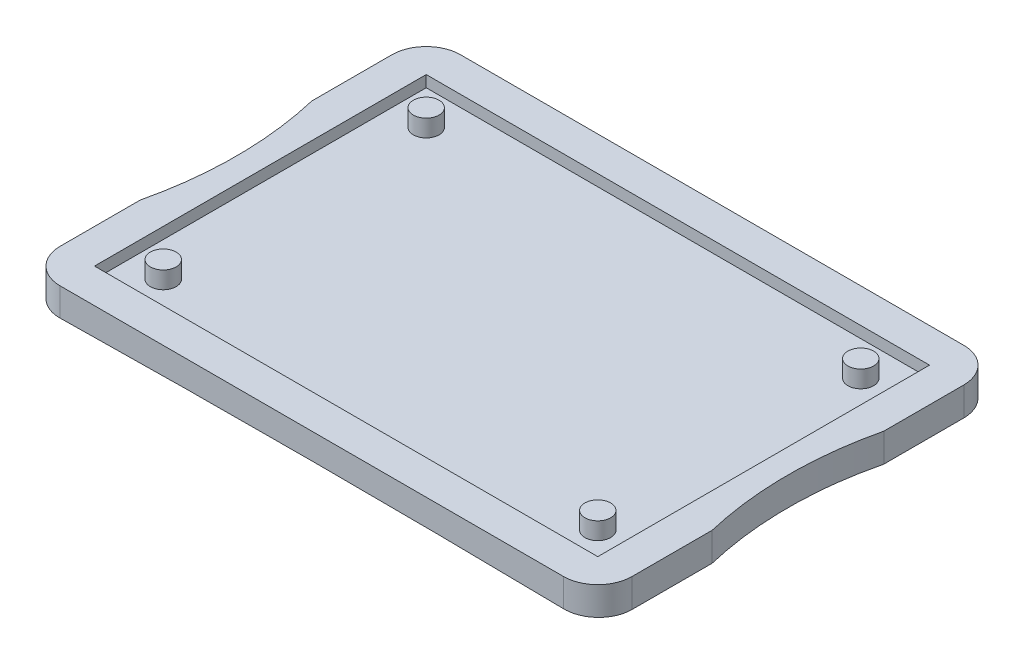
ISO-10303-21;
HEADER;
FILE_DESCRIPTION(('STEP AP214'),'2;1');
FILE_NAME('part.step','',(''),(''),'','','');
FILE_SCHEMA(('AUTOMOTIVE_DESIGN { 1 0 10303 214 1 1 1 1 }'));
ENDSEC;
DATA;
#1=APPLICATION_CONTEXT('core data for automotive mechanical design processes');
#2=APPLICATION_PROTOCOL_DEFINITION('international standard','automotive_design',2000,#1);
#3=PRODUCT_CONTEXT('',#1,'mechanical');
#4=PRODUCT('Part','Part','',(#3));
#5=PRODUCT_RELATED_PRODUCT_CATEGORY('part','',(#4));
#6=PRODUCT_DEFINITION_FORMATION('','',#4);
#7=PRODUCT_DEFINITION_CONTEXT('part definition',#1,'design');
#8=PRODUCT_DEFINITION('design','',#6,#7);
#9=PRODUCT_DEFINITION_SHAPE('','',#8);
#10=(LENGTH_UNIT() NAMED_UNIT(*) SI_UNIT(.MILLI.,.METRE.));
#11=(NAMED_UNIT(*) PLANE_ANGLE_UNIT() SI_UNIT($,.RADIAN.));
#12=(NAMED_UNIT(*) SI_UNIT($,.STERADIAN.) SOLID_ANGLE_UNIT());
#13=UNCERTAINTY_MEASURE_WITH_UNIT(LENGTH_MEASURE(1.E-05),#10,'distance_accuracy_value','');
#14=(GEOMETRIC_REPRESENTATION_CONTEXT(3) GLOBAL_UNCERTAINTY_ASSIGNED_CONTEXT((#13)) GLOBAL_UNIT_ASSIGNED_CONTEXT((#10,
#11,#12)) REPRESENTATION_CONTEXT('',''));
#15=CARTESIAN_POINT('',(0.,0.,0.));
#16=DIRECTION('',(0.,0.,1.));
#17=DIRECTION('',(1.,0.,0.));
#18=AXIS2_PLACEMENT_3D('',#15,#16,#17);
#19=CARTESIAN_POINT('',(0.,0.,0.));
#20=DIRECTION('',(0.,1.,0.));
#21=DIRECTION('',(0.,0.,1.));
#22=AXIS2_PLACEMENT_3D('',#19,#20,#21);
#23=PLANE('',#22);
#24=DIRECTION('',(0.,0.,1.));
#25=VECTOR('',#24,1.);
#26=CARTESIAN_POINT('',(-22.0000000000004,0.,0.));
#27=LINE('',#26,#25);
#28=CARTESIAN_POINT('',(-22.0000000000004,0.,-14.5000000000004));
#29=VERTEX_POINT('',#28);
#30=CARTESIAN_POINT('',(-22.0000000000004,0.,14.5000000000003));
#31=VERTEX_POINT('',#30);
#32=EDGE_CURVE('E268',#29,#31,#27,.T.);
#33=ORIENTED_EDGE('',*,*,#32,.F.);
#34=DIRECTION('',(1.,0.,0.));
#35=VECTOR('',#34,1.);
#36=CARTESIAN_POINT('',(0.,0.,-14.5000000000004));
#37=LINE('',#36,#35);
#38=CARTESIAN_POINT('',(22.0000000000004,0.,-14.5000000000004));
#39=VERTEX_POINT('',#38);
#40=EDGE_CURVE('E56',#29,#39,#37,.T.);
#41=ORIENTED_EDGE('',*,*,#40,.T.);
#42=DIRECTION('',(0.,0.,1.));
#43=VECTOR('',#42,1.);
#44=CARTESIAN_POINT('',(22.0000000000004,0.,0.));
#45=LINE('',#44,#43);
#46=CARTESIAN_POINT('',(22.0000000000004,0.,14.5000000000003));
#47=VERTEX_POINT('',#46);
#48=EDGE_CURVE('E277',#39,#47,#45,.T.);
#49=ORIENTED_EDGE('',*,*,#48,.T.);
#50=DIRECTION('',(1.,0.,0.));
#51=VECTOR('',#50,1.);
#52=CARTESIAN_POINT('',(0.,0.,14.5000000000003));
#53=LINE('',#52,#51);
#54=EDGE_CURVE('E273',#31,#47,#53,.T.);
#55=ORIENTED_EDGE('',*,*,#54,.F.);
#56=EDGE_LOOP('',(#33,#41,#49,#55));
#57=FACE_BOUND('',#56,.T.);
#58=DIRECTION('',(1.,0.,0.));
#59=VECTOR('',#58,1.);
#60=CARTESIAN_POINT('',(0.,0.,17.5));
#61=LINE('',#60,#59);
#62=CARTESIAN_POINT('',(-22.0000000000004,0.,17.5));
#63=VERTEX_POINT('',#62);
#64=CARTESIAN_POINT('',(22.0000000000004,0.,17.5));
#65=VERTEX_POINT('',#64);
#66=EDGE_CURVE('E162',#63,#65,#61,.T.);
#67=ORIENTED_EDGE('',*,*,#66,.T.);
#68=CARTESIAN_POINT('',(22.0000000000004,0.,14.5000000000004));
#69=DIRECTION('',(0.,1.,0.));
#70=DIRECTION('',(0.,0.,1.));
#71=AXIS2_PLACEMENT_3D('',#68,#69,#70);
#72=CIRCLE('',#71,2.99999999999957);
#73=CARTESIAN_POINT('',(25.,0.,14.5000000000004));
#74=VERTEX_POINT('',#73);
#75=EDGE_CURVE('E159',#65,#74,#72,.T.);
#76=ORIENTED_EDGE('',*,*,#75,.T.);
#77=DIRECTION('',(0.,0.,-1.));
#78=VECTOR('',#77,1.);
#79=CARTESIAN_POINT('',(25.,0.,0.));
#80=LINE('',#79,#78);
#81=CARTESIAN_POINT('',(25.,0.,7.49999999999998));
#82=VERTEX_POINT('',#81);
#83=EDGE_CURVE('E156',#74,#82,#80,.T.);
#84=ORIENTED_EDGE('',*,*,#83,.T.);
#85=CARTESIAN_POINT('',(56.7301610379397,0.,0.));
#86=DIRECTION('',(0.,1.,0.));
#87=DIRECTION('',(0.,0.,1.));
#88=AXIS2_PLACEMENT_3D('',#85,#86,#87);
#89=CIRCLE('',#88,32.6044953878079);
#90=CARTESIAN_POINT('',(25.,0.,-7.49999999999997));
#91=VERTEX_POINT('',#90);
#92=EDGE_CURVE('E153',#82,#91,#89,.F.);
#93=ORIENTED_EDGE('',*,*,#92,.T.);
#94=CARTESIAN_POINT('',(25.,0.,-14.5000000000004));
#95=VERTEX_POINT('',#94);
#96=EDGE_CURVE('E152',#91,#95,#80,.T.);
#97=ORIENTED_EDGE('',*,*,#96,.T.);
#98=CARTESIAN_POINT('',(22.0000000000004,0.,-14.5000000000004));
#99=DIRECTION('',(0.,1.,0.));
#100=DIRECTION('',(0.,0.,1.));
#101=AXIS2_PLACEMENT_3D('',#98,#99,#100);
#102=CIRCLE('',#101,2.99999999999957);
#103=CARTESIAN_POINT('',(22.0000000000004,0.,-17.5));
#104=VERTEX_POINT('',#103);
#105=EDGE_CURVE('E147',#95,#104,#102,.T.);
#106=ORIENTED_EDGE('',*,*,#105,.T.);
#107=DIRECTION('',(1.,0.,0.));
#108=VECTOR('',#107,1.);
#109=CARTESIAN_POINT('',(0.,0.,-17.5));
#110=LINE('',#109,#108);
#111=CARTESIAN_POINT('',(-22.0000000000004,0.,-17.5));
#112=VERTEX_POINT('',#111);
#113=EDGE_CURVE('E141',#112,#104,#110,.T.);
#114=ORIENTED_EDGE('',*,*,#113,.F.);
#115=CARTESIAN_POINT('',(-22.0000000000004,0.,-14.5000000000004));
#116=DIRECTION('',(0.,1.,0.));
#117=DIRECTION('',(0.,0.,1.));
#118=AXIS2_PLACEMENT_3D('',#115,#116,#117);
#119=CIRCLE('',#118,2.99999999999957);
#120=CARTESIAN_POINT('',(-25.,0.,-14.5000000000004));
#121=VERTEX_POINT('',#120);
#122=EDGE_CURVE('E135',#121,#112,#119,.F.);
#123=ORIENTED_EDGE('',*,*,#122,.F.);
#124=DIRECTION('',(0.,0.,-1.));
#125=VECTOR('',#124,1.);
#126=CARTESIAN_POINT('',(-25.,0.,0.));
#127=LINE('',#126,#125);
#128=CARTESIAN_POINT('',(-25.,0.,-7.50000000000004));
#129=VERTEX_POINT('',#128);
#130=EDGE_CURVE('E132',#129,#121,#127,.T.);
#131=ORIENTED_EDGE('',*,*,#130,.F.);
#132=CARTESIAN_POINT('',(-56.7301610379397,0.,0.));
#133=DIRECTION('',(0.,1.,0.));
#134=DIRECTION('',(0.,0.,1.));
#135=AXIS2_PLACEMENT_3D('',#132,#133,#134);
#136=CIRCLE('',#135,32.6044953878079);
#137=CARTESIAN_POINT('',(-25.,0.,7.50000000000003));
#138=VERTEX_POINT('',#137);
#139=EDGE_CURVE('E130',#138,#129,#136,.T.);
#140=ORIENTED_EDGE('',*,*,#139,.F.);
#141=CARTESIAN_POINT('',(-25.,0.,14.5000000000003));
#142=VERTEX_POINT('',#141);
#143=EDGE_CURVE('E118',#142,#138,#127,.T.);
#144=ORIENTED_EDGE('',*,*,#143,.F.);
#145=CARTESIAN_POINT('',(-22.0000000000004,0.,14.5000000000003));
#146=DIRECTION('',(0.,1.,0.));
#147=DIRECTION('',(0.,0.,1.));
#148=AXIS2_PLACEMENT_3D('',#145,#146,#147);
#149=CIRCLE('',#148,2.99999999999971);
#150=EDGE_CURVE('E106',#63,#142,#149,.F.);
#151=ORIENTED_EDGE('',*,*,#150,.F.);
#152=EDGE_LOOP('',(#67,#76,#84,#93,#97,#106,#114,#123,#131,#140,#144,#151));
#153=FACE_BOUND('',#152,.T.);
#154=ADVANCED_FACE('F39',(#57,#153),#23,.T.);
#155=CARTESIAN_POINT('',(0.,-2.5,17.5));
#156=DIRECTION('',(0.,0.,1.));
#157=DIRECTION('',(1.,0.,0.));
#158=AXIS2_PLACEMENT_3D('',#155,#156,#157);
#159=PLANE('',#158);
#160=CARTESIAN_POINT('',(0.,-1252.375,17.5));
#161=DIRECTION('',(0.,0.,1.));
#162=DIRECTION('',(-1.,0.,0.));
#163=AXIS2_PLACEMENT_3D('',#160,#161,#162);
#164=CIRCLE('',#163,1250.125);
#165=CARTESIAN_POINT('',(22.0000000000004,-2.44359563214402,17.5));
#166=VERTEX_POINT('',#165);
#167=CARTESIAN_POINT('',(-22.0000000000004,-2.44359563214402,17.5));
#168=VERTEX_POINT('',#167);
#169=EDGE_CURVE('E287',#166,#168,#164,.T.);
#170=ORIENTED_EDGE('',*,*,#169,.F.);
#171=DIRECTION('',(0.,1.,0.));
#172=VECTOR('',#171,1.);
#173=CARTESIAN_POINT('',(22.0000000000004,-2.5,17.5));
#174=LINE('',#173,#172);
#175=EDGE_CURVE('E43',#166,#65,#174,.T.);
#176=ORIENTED_EDGE('',*,*,#175,.T.);
#177=ORIENTED_EDGE('',*,*,#66,.F.);
#178=DIRECTION('',(0.,1.,0.));
#179=VECTOR('',#178,1.);
#180=CARTESIAN_POINT('',(-22.0000000000004,-2.5,17.5));
#181=LINE('',#180,#179);
#182=EDGE_CURVE('E11',#168,#63,#181,.T.);
#183=ORIENTED_EDGE('',*,*,#182,.F.);
#184=EDGE_LOOP('',(#170,#176,#177,#183));
#185=FACE_BOUND('',#184,.T.);
#186=ADVANCED_FACE('F41',(#185),#159,.T.);
#187=CARTESIAN_POINT('',(-22.0000000000004,-2.5,14.5000000000003));
#188=DIRECTION('',(0.,1.,0.));
#189=DIRECTION('',(0.,0.,1.));
#190=AXIS2_PLACEMENT_3D('',#187,#188,#189);
#191=CYLINDRICAL_SURFACE('',#190,2.99999999999971);
#192=DIRECTION('',(0.,1.,0.));
#193=VECTOR('',#192,1.);
#194=CARTESIAN_POINT('',(-25.,-2.5,14.5000000000003));
#195=LINE('',#194,#193);
#196=CARTESIAN_POINT('',(-25.,-2.5,14.5000000000003));
#197=VERTEX_POINT('',#196);
#198=EDGE_CURVE('E48',#197,#142,#195,.T.);
#199=ORIENTED_EDGE('',*,*,#198,.F.);
#200=CARTESIAN_POINT('',(-25.0000000000001,-2.49999999999995,14.5000000000003));
#201=CARTESIAN_POINT('',(-25.0000080943151,-2.5000002258265,14.5843680196033));
#202=CARTESIAN_POINT('',(-24.9964410482757,-2.4999288156822,14.6687322009698));
#203=CARTESIAN_POINT('',(-24.9822193128772,-2.49964443997647,14.836856848726));
#204=CARTESIAN_POINT('',(-24.9715649666263,-2.49943148126765,14.9206173441429));
#205=CARTESIAN_POINT('',(-24.9432420435681,-2.49886594003202,15.0868835425197));
#206=CARTESIAN_POINT('',(-24.9255788135852,-2.4985134639385,15.1693901523223));
#207=CARTESIAN_POINT('',(-24.8833815474104,-2.49767266403158,15.3326016998995));
#208=CARTESIAN_POINT('',(-24.8588475945012,-2.49718434186483,15.4133066594999));
#209=CARTESIAN_POINT('',(-24.7751382560609,-2.49552128352641,15.6519400461725));
#210=CARTESIAN_POINT('',(-24.7058437355695,-2.49414822103403,15.8064550368164));
#211=CARTESIAN_POINT('',(-24.5423503202833,-2.49092725450145,16.1015441272843));
#212=CARTESIAN_POINT('',(-24.4481557689012,-2.48907943327691,16.2421206525759));
#213=CARTESIAN_POINT('',(-24.2374958347857,-2.48497664136367,16.505501132801));
#214=CARTESIAN_POINT('',(-24.1210285601652,-2.4827216360889,16.6283035764127));
#215=CARTESIAN_POINT('',(-23.8691119515847,-2.47788545224965,16.8526314486162));
#216=CARTESIAN_POINT('',(-23.733658899384,-2.4753042098035,16.9541526996828));
#217=CARTESIAN_POINT('',(-23.4475967358469,-2.46990508819591,17.1330481607604));
#218=CARTESIAN_POINT('',(-23.2969818964498,-2.46708711966737,17.2104131990356));
#219=CARTESIAN_POINT('',(-22.984933599399,-2.46130988579311,17.3387184186104));
#220=CARTESIAN_POINT('',(-22.8235065189199,-2.45835070402751,17.3896740241638));
#221=CARTESIAN_POINT('',(-22.5509120279788,-2.45340897219411,17.4510690511583));
#222=CARTESIAN_POINT('',(-22.4414580678721,-2.45143889924269,17.4694070141888));
#223=CARTESIAN_POINT('',(-22.2213514407036,-2.44750634839786,17.4938709045381));
#224=CARTESIAN_POINT('',(-22.1107006960843,-2.44554386369247,17.5000141325517));
#225=CARTESIAN_POINT('',(-22.0000000000004,-2.44359563214423,17.5));
#226=B_SPLINE_CURVE_WITH_KNOTS('',3,(#200,#201,#202,#203,#204,#205,#206,#207,#208,#209,#210,
#211,#212,#213,#214,#215,#216,#217,#218,#219,#220,#221,#222,#223,#224,#225),.UNSPECIFIED.,.F.,
.F.,(4,2,2,2,2,2,2,2,2,2,2,2,4),(0.,0.253021727857576,0.506031207397822,0.758848045065451,
1.01166181837214,1.51708483358746,2.02241974393697,2.52779759746472,3.03327456460016,
3.5389432206995,4.04431621062554,4.37667454005049,4.70856101410207),.UNSPECIFIED.);
#227=EDGE_CURVE('E164',#197,#168,#226,.T.);
#228=ORIENTED_EDGE('',*,*,#227,.T.);
#229=ORIENTED_EDGE('',*,*,#182,.T.);
#230=ORIENTED_EDGE('',*,*,#150,.T.);
#231=EDGE_LOOP('',(#199,#228,#229,#230));
#232=FACE_BOUND('',#231,.T.);
#233=ADVANCED_FACE('F108',(#232),#191,.T.);
#234=CARTESIAN_POINT('',(-25.,-2.5,0.));
#235=DIRECTION('',(1.,0.,0.));
#236=DIRECTION('',(0.,0.,-1.));
#237=AXIS2_PLACEMENT_3D('',#234,#235,#236);
#238=PLANE('',#237);
#239=ORIENTED_EDGE('',*,*,#143,.T.);
#240=DIRECTION('',(0.,1.,0.));
#241=VECTOR('',#240,1.);
#242=CARTESIAN_POINT('',(-25.,-2.5,7.50000000000003));
#243=LINE('',#242,#241);
#244=CARTESIAN_POINT('',(-25.,-2.5,7.50000000000003));
#245=VERTEX_POINT('',#244);
#246=EDGE_CURVE('E126',#245,#138,#243,.T.);
#247=ORIENTED_EDGE('',*,*,#246,.F.);
#248=DIRECTION('',(0.,0.,-1.));
#249=VECTOR('',#248,1.);
#250=CARTESIAN_POINT('',(-25.,-2.5,0.));
#251=LINE('',#250,#249);
#252=EDGE_CURVE('E125',#197,#245,#251,.T.);
#253=ORIENTED_EDGE('',*,*,#252,.F.);
#254=ORIENTED_EDGE('',*,*,#198,.T.);
#255=EDGE_LOOP('',(#239,#247,#253,#254));
#256=FACE_BOUND('',#255,.T.);
#257=ADVANCED_FACE('F121',(#256),#238,.F.);
#258=CARTESIAN_POINT('',(-56.7301610379397,-2.5,0.));
#259=DIRECTION('',(0.,1.,0.));
#260=DIRECTION('',(0.,0.,1.));
#261=AXIS2_PLACEMENT_3D('',#258,#259,#260);
#262=CYLINDRICAL_SURFACE('',#261,32.6044953878079);
#263=DIRECTION('',(0.,1.,0.));
#264=VECTOR('',#263,1.);
#265=CARTESIAN_POINT('',(-25.,-2.5,-7.50000000000004));
#266=LINE('',#265,#264);
#267=CARTESIAN_POINT('',(-25.,-2.5,-7.50000000002705));
#268=VERTEX_POINT('',#267);
#269=EDGE_CURVE('E331',#268,#129,#266,.T.);
#270=ORIENTED_EDGE('',*,*,#269,.F.);
#271=CARTESIAN_POINT('',(-25.,-2.49999999999995,-7.50000000000004));
#272=CARTESIAN_POINT('',(-24.8935874789443,-2.4978718645789,-7.04979737294275));
#273=CARTESIAN_POINT('',(-24.7967697792002,-2.49594853593022,-6.5973873203352));
#274=CARTESIAN_POINT('',(-24.6224653902994,-2.49250249679365,-5.68885156003972));
#275=CARTESIAN_POINT('',(-24.5449789265648,-2.49097979097742,-5.23272580908693));
#276=CARTESIAN_POINT('',(-24.3417041288131,-2.48699863887152,-3.85965251272831));
#277=CARTESIAN_POINT('',(-24.245144025662,-2.48512802095555,-2.93819361789949));
#278=CARTESIAN_POINT('',(-24.1318543359527,-2.48293578183063,-1.10825505410329));
#279=CARTESIAN_POINT('',(-24.1136331293482,-2.48258521677869,-0.199864248013373));
#280=CARTESIAN_POINT('',(-24.1530543074769,-2.48334623166317,1.61495481412062));
#281=CARTESIAN_POINT('',(-24.2106547074646,-2.48445700241304,2.52138387813735));
#282=CARTESIAN_POINT('',(-24.3419818271918,-2.48701116663494,3.76526191430653));
#283=CARTESIAN_POINT('',(-24.383461432071,-2.48781925995652,4.10636683304635));
#284=CARTESIAN_POINT('',(-24.4771732589934,-2.48965091306505,4.78705027085108));
#285=CARTESIAN_POINT('',(-24.5294033796691,-2.49067443074459,5.12662907498545));
#286=CARTESIAN_POINT('',(-24.6449943520294,-2.49294826342736,5.80645904156246));
#287=CARTESIAN_POINT('',(-24.7084344819484,-2.4942001960025,6.14669668021696));
#288=CARTESIAN_POINT('',(-24.8461258250531,-2.49692982218441,6.82504532798825));
#289=CARTESIAN_POINT('',(-24.9203791397939,-2.49840755967939,7.16315591035312));
#290=CARTESIAN_POINT('',(-25.,-2.49999999999996,7.50000000000003));
#291=B_SPLINE_CURVE_WITH_KNOTS('',3,(#271,#272,#273,#274,#275,#276,#277,#278,#279,#280,#281,
#282,#283,#284,#285,#286,#287,#288,#289,#290),.UNSPECIFIED.,.F.,.F.,(4,2,2,2,2,2,2,2,2,4),(0.,
1.38761401794717,2.77524421615729,5.55107210119524,8.27380572333535,10.9950323185259,
12.0257690594783,13.0563045167438,14.0944431493892,15.1327838154346),.UNSPECIFIED.);
#292=EDGE_CURVE('E178',#268,#245,#291,.T.);
#293=ORIENTED_EDGE('',*,*,#292,.T.);
#294=ORIENTED_EDGE('',*,*,#246,.T.);
#295=ORIENTED_EDGE('',*,*,#139,.T.);
#296=EDGE_LOOP('',(#270,#293,#294,#295));
#297=FACE_BOUND('',#296,.T.);
#298=ADVANCED_FACE('F234',(#297),#262,.F.);
#299=ORIENTED_EDGE('',*,*,#130,.T.);
#300=DIRECTION('',(0.,1.,0.));
#301=VECTOR('',#300,1.);
#302=CARTESIAN_POINT('',(-25.,-2.5,-14.5000000000004));
#303=LINE('',#302,#301);
#304=CARTESIAN_POINT('',(-25.,-2.5,-14.5000000000004));
#305=VERTEX_POINT('',#304);
#306=EDGE_CURVE('E329',#305,#121,#303,.T.);
#307=ORIENTED_EDGE('',*,*,#306,.F.);
#308=EDGE_CURVE('E165',#268,#305,#251,.T.);
#309=ORIENTED_EDGE('',*,*,#308,.F.);
#310=ORIENTED_EDGE('',*,*,#269,.T.);
#311=EDGE_LOOP('',(#299,#307,#309,#310));
#312=FACE_BOUND('',#311,.T.);
#313=ADVANCED_FACE('F233',(#312),#238,.F.);
#314=CARTESIAN_POINT('',(-22.0000000000004,-2.5,-14.5000000000004));
#315=DIRECTION('',(0.,1.,0.));
#316=DIRECTION('',(0.,0.,1.));
#317=AXIS2_PLACEMENT_3D('',#314,#315,#316);
#318=CYLINDRICAL_SURFACE('',#317,2.99999999999957);
#319=DIRECTION('',(0.,1.,0.));
#320=VECTOR('',#319,1.);
#321=CARTESIAN_POINT('',(-22.0000000000004,-2.5,-17.5));
#322=LINE('',#321,#320);
#323=CARTESIAN_POINT('',(-22.0000000000004,-2.44359563214402,-17.5));
#324=VERTEX_POINT('',#323);
#325=EDGE_CURVE('E327',#324,#112,#322,.T.);
#326=ORIENTED_EDGE('',*,*,#325,.F.);
#327=CARTESIAN_POINT('',(-22.0000000000004,-2.44359563214402,-17.5));
#328=CARTESIAN_POINT('',(-22.0843915307538,-2.4450809215032,-17.5000080778842));
#329=CARTESIAN_POINT('',(-22.1687790729649,-2.44657485455215,-17.4964390635945));
#330=CARTESIAN_POINT('',(-22.3369501155067,-2.44956890316565,-17.4822094449819));
#331=CARTESIAN_POINT('',(-22.4207336445433,-2.45106901843098,-17.4715491799486));
#332=CARTESIAN_POINT('',(-22.5870462545633,-2.45406334504735,-17.4432102977759));
#333=CARTESIAN_POINT('',(-22.6695762311411,-2.45555755998861,-17.4255369621547));
#334=CARTESIAN_POINT('',(-22.8328338693148,-2.45852918989367,-17.3833152385647));
#335=CARTESIAN_POINT('',(-22.9135615529062,-2.4600066050624,-17.3587669345484));
#336=CARTESIAN_POINT('',(-23.1522623502335,-2.46439776144914,-17.2750077044542));
#337=CARTESIAN_POINT('',(-23.3068208012794,-2.46727163235487,-17.2056708818632));
#338=CARTESIAN_POINT('',(-23.6019898514725,-2.47281039722407,-17.0420734499964));
#339=CARTESIAN_POINT('',(-23.7426029135432,-2.4754753280714,-16.9478172525997));
#340=CARTESIAN_POINT('',(-24.00602524638,-2.48050695589955,-16.7370292679186));
#341=CARTESIAN_POINT('',(-24.1288356164471,-2.48287367129373,-16.6204988570789));
#342=CARTESIAN_POINT('',(-24.3531672094673,-2.48722443693995,-16.3684421891725));
#343=CARTESIAN_POINT('',(-24.4546842722032,-2.48920841240743,-16.2329122286488));
#344=CARTESIAN_POINT('',(-24.6335220993257,-2.49272024672698,-15.9467349092314));
#345=CARTESIAN_POINT('',(-24.7108420198175,-2.49424808967097,-15.7960870233298));
#346=CARTESIAN_POINT('',(-24.8390517055855,-2.49678942369588,-15.4839743086418));
#347=CARTESIAN_POINT('',(-24.8899570250151,-2.49780321746498,-15.3225159089812));
#348=CARTESIAN_POINT('',(-24.951222307938,-2.4990250659577,-15.0500553325425));
#349=CARTESIAN_POINT('',(-24.9695028854316,-2.49939026669562,-14.9407692191108));
#350=CARTESIAN_POINT('',(-24.9938901206846,-2.49987778816292,-14.7210040318401));
#351=CARTESIAN_POINT('',(-25.0000140328711,-2.50000045313174,-14.6105268729054));
#352=CARTESIAN_POINT('',(-25.,-2.49999999999996,-14.5000000000004));
#353=B_SPLINE_CURVE_WITH_KNOTS('',3,(#327,#328,#329,#330,#331,#332,#333,#334,#335,#336,#337,
#338,#339,#340,#341,#342,#343,#344,#345,#346,#347,#348,#349,#350,#351,#352),.UNSPECIFIED.,.F.,
.F.,(4,2,2,2,2,2,2,2,2,2,2,2,4),(0.,0.253131453157025,0.506250795799775,0.759179875853131,
1.01210586743938,1.51775468416597,2.02331403760123,2.52884215987031,3.03446895877152,
3.54011338985082,4.04545973497031,4.37724522119267,4.70855945372909),.UNSPECIFIED.);
#354=EDGE_CURVE('E221',#324,#305,#353,.T.);
#355=ORIENTED_EDGE('',*,*,#354,.T.);
#356=ORIENTED_EDGE('',*,*,#306,.T.);
#357=ORIENTED_EDGE('',*,*,#122,.T.);
#358=EDGE_LOOP('',(#326,#355,#356,#357));
#359=FACE_BOUND('',#358,.T.);
#360=ADVANCED_FACE('F228',(#359),#318,.T.);
#361=CARTESIAN_POINT('',(0.,-2.5,-17.5));
#362=DIRECTION('',(0.,0.,1.));
#363=DIRECTION('',(1.,0.,0.));
#364=AXIS2_PLACEMENT_3D('',#361,#362,#363);
#365=PLANE('',#364);
#366=DIRECTION('',(0.,1.,0.));
#367=VECTOR('',#366,1.);
#368=CARTESIAN_POINT('',(22.0000000000004,-2.5,-17.5));
#369=LINE('',#368,#367);
#370=CARTESIAN_POINT('',(22.0000000000004,-2.44359563214402,-17.5));
#371=VERTEX_POINT('',#370);
#372=EDGE_CURVE('E325',#371,#104,#369,.T.);
#373=ORIENTED_EDGE('',*,*,#372,.F.);
#374=CARTESIAN_POINT('',(0.,-1252.375,-17.5));
#375=DIRECTION('',(0.,0.,1.));
#376=DIRECTION('',(-1.,0.,0.));
#377=AXIS2_PLACEMENT_3D('',#374,#375,#376);
#378=CIRCLE('',#377,1250.125);
#379=EDGE_CURVE('E298',#371,#324,#378,.T.);
#380=ORIENTED_EDGE('',*,*,#379,.T.);
#381=ORIENTED_EDGE('',*,*,#325,.T.);
#382=ORIENTED_EDGE('',*,*,#113,.T.);
#383=EDGE_LOOP('',(#373,#380,#381,#382));
#384=FACE_BOUND('',#383,.T.);
#385=ADVANCED_FACE('F232',(#384),#365,.F.);
#386=CARTESIAN_POINT('',(22.0000000000004,-2.5,-14.5000000000004));
#387=DIRECTION('',(0.,1.,0.));
#388=DIRECTION('',(0.,0.,1.));
#389=AXIS2_PLACEMENT_3D('',#386,#387,#388);
#390=CYLINDRICAL_SURFACE('',#389,2.99999999999957);
#391=CARTESIAN_POINT('',(22.0000000000004,-2.44359563214402,-17.5));
#392=CARTESIAN_POINT('',(22.0843915307538,-2.4450809215032,-17.5000080778842));
#393=CARTESIAN_POINT('',(22.1687790729649,-2.44657485455215,-17.4964390635945));
#394=CARTESIAN_POINT('',(22.3369501155067,-2.44956890316565,-17.4822094449819));
#395=CARTESIAN_POINT('',(22.4207336445433,-2.45106901843098,-17.4715491799486));
#396=CARTESIAN_POINT('',(22.5870462545633,-2.45406334504735,-17.4432102977759));
#397=CARTESIAN_POINT('',(22.6695762311411,-2.45555755998861,-17.4255369621547));
#398=CARTESIAN_POINT('',(22.8328338693148,-2.45852918989367,-17.3833152385647));
#399=CARTESIAN_POINT('',(22.9135615529062,-2.4600066050624,-17.3587669345484));
#400=CARTESIAN_POINT('',(23.1522623502335,-2.46439776144915,-17.2750077044542));
#401=CARTESIAN_POINT('',(23.3068208012794,-2.46727163235487,-17.2056708818632));
#402=CARTESIAN_POINT('',(23.6019898514725,-2.47281039722407,-17.0420734499964));
#403=CARTESIAN_POINT('',(23.7426029135432,-2.4754753280714,-16.9478172525997));
#404=CARTESIAN_POINT('',(24.0060252463799,-2.48050695589955,-16.7370292679186));
#405=CARTESIAN_POINT('',(24.1288356164471,-2.48287367129373,-16.6204988570789));
#406=CARTESIAN_POINT('',(24.3531672094673,-2.48722443693995,-16.3684421891725));
#407=CARTESIAN_POINT('',(24.4546842722032,-2.48920841240743,-16.2329122286488));
#408=CARTESIAN_POINT('',(24.6335220993257,-2.49272024672698,-15.9467349092314));
#409=CARTESIAN_POINT('',(24.7108420198175,-2.49424808967097,-15.7960870233298));
#410=CARTESIAN_POINT('',(24.8390517055855,-2.49678942369588,-15.4839743086418));
#411=CARTESIAN_POINT('',(24.8899570250151,-2.49780321746498,-15.3225159089812));
#412=CARTESIAN_POINT('',(24.951222307938,-2.4990250659577,-15.0500553325425));
#413=CARTESIAN_POINT('',(24.9695028854316,-2.49939026669562,-14.9407692191108));
#414=CARTESIAN_POINT('',(24.9938901206846,-2.49987778816292,-14.7210040318401));
#415=CARTESIAN_POINT('',(25.0000140328711,-2.50000045313174,-14.6105268729054));
#416=CARTESIAN_POINT('',(25.,-2.49999999999996,-14.5000000000004));
#417=B_SPLINE_CURVE_WITH_KNOTS('',3,(#391,#392,#393,#394,#395,#396,#397,#398,#399,#400,#401,
#402,#403,#404,#405,#406,#407,#408,#409,#410,#411,#412,#413,#414,#415,#416),.UNSPECIFIED.,.F.,
.F.,(4,2,2,2,2,2,2,2,2,2,2,2,4),(0.,0.253131453157025,0.506250795799775,0.759179875853131,
1.01210586743938,1.51775468416597,2.02331403760123,2.52884215987031,3.03446895877152,
3.54011338985082,4.04545973497031,4.37724522119267,4.70855945372909),.UNSPECIFIED.);
#418=CARTESIAN_POINT('',(25.,-2.5,-14.5000000000004));
#419=VERTEX_POINT('',#418);
#420=EDGE_CURVE('E65',#371,#419,#417,.T.);
#421=ORIENTED_EDGE('',*,*,#420,.F.);
#422=ORIENTED_EDGE('',*,*,#372,.T.);
#423=ORIENTED_EDGE('',*,*,#105,.F.);
#424=DIRECTION('',(0.,1.,0.));
#425=VECTOR('',#424,1.);
#426=CARTESIAN_POINT('',(25.,-2.5,-14.5000000000004));
#427=LINE('',#426,#425);
#428=EDGE_CURVE('E323',#419,#95,#427,.T.);
#429=ORIENTED_EDGE('',*,*,#428,.F.);
#430=EDGE_LOOP('',(#421,#422,#423,#429));
#431=FACE_BOUND('',#430,.T.);
#432=ADVANCED_FACE('F237',(#431),#390,.T.);
#433=CARTESIAN_POINT('',(25.,-2.5,0.));
#434=DIRECTION('',(1.,0.,0.));
#435=DIRECTION('',(0.,0.,-1.));
#436=AXIS2_PLACEMENT_3D('',#433,#434,#435);
#437=PLANE('',#436);
#438=ORIENTED_EDGE('',*,*,#96,.F.);
#439=DIRECTION('',(0.,1.,0.));
#440=VECTOR('',#439,1.);
#441=CARTESIAN_POINT('',(25.,-2.5,-7.49999999999997));
#442=LINE('',#441,#440);
#443=CARTESIAN_POINT('',(25.,-2.5,-7.49999999999997));
#444=VERTEX_POINT('',#443);
#445=EDGE_CURVE('E316',#444,#91,#442,.T.);
#446=ORIENTED_EDGE('',*,*,#445,.F.);
#447=DIRECTION('',(0.,0.,-1.));
#448=VECTOR('',#447,1.);
#449=CARTESIAN_POINT('',(25.,-2.5,0.));
#450=LINE('',#449,#448);
#451=EDGE_CURVE('E168',#444,#419,#450,.T.);
#452=ORIENTED_EDGE('',*,*,#451,.T.);
#453=ORIENTED_EDGE('',*,*,#428,.T.);
#454=EDGE_LOOP('',(#438,#446,#452,#453));
#455=FACE_BOUND('',#454,.T.);
#456=ADVANCED_FACE('F242',(#455),#437,.T.);
#457=CARTESIAN_POINT('',(56.7301610379397,-2.5,0.));
#458=DIRECTION('',(0.,1.,0.));
#459=DIRECTION('',(0.,0.,1.));
#460=AXIS2_PLACEMENT_3D('',#457,#458,#459);
#461=CYLINDRICAL_SURFACE('',#460,32.6044953878079);
#462=CARTESIAN_POINT('',(25.,-2.49999999999995,-7.49999999999998));
#463=CARTESIAN_POINT('',(24.8935874789443,-2.4978718645789,-7.04979737294269));
#464=CARTESIAN_POINT('',(24.7967697792002,-2.49594853593022,-6.59738732033514));
#465=CARTESIAN_POINT('',(24.6224653902994,-2.49250249679365,-5.68885156003966));
#466=CARTESIAN_POINT('',(24.5449789265648,-2.49097979097742,-5.23272580908687));
#467=CARTESIAN_POINT('',(24.3417041288131,-2.48699863887152,-3.85965251272824));
#468=CARTESIAN_POINT('',(24.245144025662,-2.48512802095555,-2.93819361789942));
#469=CARTESIAN_POINT('',(24.1318543359527,-2.48293578183063,-1.10825505410323));
#470=CARTESIAN_POINT('',(24.1136331293482,-2.48258521677869,-0.199864248013308));
#471=CARTESIAN_POINT('',(24.1530543074769,-2.48334623166317,1.61495481412069));
#472=CARTESIAN_POINT('',(24.2106547074646,-2.48445700241304,2.52138387813741));
#473=CARTESIAN_POINT('',(24.3419818271918,-2.48701116663494,3.76526191430656));
#474=CARTESIAN_POINT('',(24.383461432071,-2.48781925995652,4.10636683304635));
#475=CARTESIAN_POINT('',(24.4771732589934,-2.48965091306505,4.78705027085102));
#476=CARTESIAN_POINT('',(24.5294033796691,-2.49067443074459,5.12662907498536));
#477=CARTESIAN_POINT('',(24.6449943520293,-2.49294826342736,5.8064590415623));
#478=CARTESIAN_POINT('',(24.7084344819484,-2.4942001960025,6.14669668021677));
#479=CARTESIAN_POINT('',(24.8461258250531,-2.49692982218441,6.825045327988));
#480=CARTESIAN_POINT('',(24.9203791397939,-2.49840755967939,7.16315591035284));
#481=CARTESIAN_POINT('',(24.9999999999999,-2.49999999999996,7.49999999999972));
#482=B_SPLINE_CURVE_WITH_KNOTS('',3,(#462,#463,#464,#465,#466,#467,#468,#469,#470,#471,#472,
#473,#474,#475,#476,#477,#478,#479,#480,#481),.UNSPECIFIED.,.F.,.F.,(4,2,2,2,2,2,2,2,2,4),(0.,
1.38761401794717,2.77524421615729,5.55107210119524,8.27380572333535,10.9950323185259,
12.0257690594783,13.0563045167436,14.0944431493889,15.1327838154342),.UNSPECIFIED.);
#483=CARTESIAN_POINT('',(25.,-2.5,7.50000000002705));
#484=VERTEX_POINT('',#483);
#485=EDGE_CURVE('E208',#444,#484,#482,.T.);
#486=ORIENTED_EDGE('',*,*,#485,.F.);
#487=ORIENTED_EDGE('',*,*,#445,.T.);
#488=ORIENTED_EDGE('',*,*,#92,.F.);
#489=DIRECTION('',(0.,1.,0.));
#490=VECTOR('',#489,1.);
#491=CARTESIAN_POINT('',(25.,-2.5,7.49999999999998));
#492=LINE('',#491,#490);
#493=EDGE_CURVE('E314',#484,#82,#492,.T.);
#494=ORIENTED_EDGE('',*,*,#493,.F.);
#495=EDGE_LOOP('',(#486,#487,#488,#494));
#496=FACE_BOUND('',#495,.T.);
#497=ADVANCED_FACE('F245',(#496),#461,.F.);
#498=ORIENTED_EDGE('',*,*,#83,.F.);
#499=DIRECTION('',(0.,1.,0.));
#500=VECTOR('',#499,1.);
#501=CARTESIAN_POINT('',(25.,-2.5,14.5000000000004));
#502=LINE('',#501,#500);
#503=CARTESIAN_POINT('',(25.,-2.5,14.5000000000004));
#504=VERTEX_POINT('',#503);
#505=EDGE_CURVE('E317',#504,#74,#502,.T.);
#506=ORIENTED_EDGE('',*,*,#505,.F.);
#507=EDGE_CURVE('E117',#504,#484,#450,.T.);
#508=ORIENTED_EDGE('',*,*,#507,.T.);
#509=ORIENTED_EDGE('',*,*,#493,.T.);
#510=EDGE_LOOP('',(#498,#506,#508,#509));
#511=FACE_BOUND('',#510,.T.);
#512=ADVANCED_FACE('F247',(#511),#437,.T.);
#513=CARTESIAN_POINT('',(22.0000000000004,-2.5,14.5000000000004));
#514=DIRECTION('',(0.,1.,0.));
#515=DIRECTION('',(0.,0.,1.));
#516=AXIS2_PLACEMENT_3D('',#513,#514,#515);
#517=CYLINDRICAL_SURFACE('',#516,2.99999999999957);
#518=CARTESIAN_POINT('',(25.,-2.49999999999995,14.5000000000004));
#519=CARTESIAN_POINT('',(25.000008094315,-2.5000002258265,14.5843680196035));
#520=CARTESIAN_POINT('',(24.9964410482756,-2.4999288156822,14.6687322009699));
#521=CARTESIAN_POINT('',(24.9822193128771,-2.49964443997647,14.8368568487261));
#522=CARTESIAN_POINT('',(24.9715649666262,-2.49943148126765,14.920617344143));
#523=CARTESIAN_POINT('',(24.943242043568,-2.49886594003202,15.0868835425199));
#524=CARTESIAN_POINT('',(24.9255788135851,-2.4985134639385,15.1693901523224));
#525=CARTESIAN_POINT('',(24.8833815474103,-2.49767266403158,15.3326016998996));
#526=CARTESIAN_POINT('',(24.8588475945011,-2.49718434186483,15.4133066595));
#527=CARTESIAN_POINT('',(24.7751382560608,-2.49552128352641,15.6519400461726));
#528=CARTESIAN_POINT('',(24.7058437355694,-2.49414822103403,15.8064550368165));
#529=CARTESIAN_POINT('',(24.5423503202832,-2.49092725450145,16.1015441272843));
#530=CARTESIAN_POINT('',(24.4481557689012,-2.48907943327691,16.242120652576));
#531=CARTESIAN_POINT('',(24.2374958347857,-2.48497664136367,16.5055011328011));
#532=CARTESIAN_POINT('',(24.1210285601652,-2.4827216360889,16.6283035764127));
#533=CARTESIAN_POINT('',(23.8691119515847,-2.47788545224965,16.8526314486162));
#534=CARTESIAN_POINT('',(23.733658899384,-2.4753042098035,16.9541526996828));
#535=CARTESIAN_POINT('',(23.4475967358469,-2.46990508819591,17.1330481607604));
#536=CARTESIAN_POINT('',(23.2969818964498,-2.46708711966738,17.2104131990356));
#537=CARTESIAN_POINT('',(22.984933599399,-2.46130988579311,17.3387184186104));
#538=CARTESIAN_POINT('',(22.82350651892,-2.45835070402751,17.3896740241638));
#539=CARTESIAN_POINT('',(22.5509120279789,-2.45340897219411,17.4510690511583));
#540=CARTESIAN_POINT('',(22.4414580678721,-2.45143889924269,17.4694070141888));
#541=CARTESIAN_POINT('',(22.2213514407037,-2.44750634839786,17.4938709045381));
#542=CARTESIAN_POINT('',(22.1107006960844,-2.44554386369248,17.5000141325517));
#543=CARTESIAN_POINT('',(22.0000000000004,-2.44359563214423,17.5));
#544=B_SPLINE_CURVE_WITH_KNOTS('',3,(#518,#519,#520,#521,#522,#523,#524,#525,#526,#527,#528,
#529,#530,#531,#532,#533,#534,#535,#536,#537,#538,#539,#540,#541,#542,#543),.UNSPECIFIED.,.F.,
.F.,(4,2,2,2,2,2,2,2,2,2,2,2,4),(0.,0.253021727857564,0.506031207397798,0.758848045065414,
1.01166181837209,1.51708483358738,2.02241974393687,2.52779759746459,3.03327456460001,
3.53894322069932,4.04431621062534,4.37667454005027,4.70856101410184),.UNSPECIFIED.);
#545=EDGE_CURVE('E199',#504,#166,#544,.T.);
#546=ORIENTED_EDGE('',*,*,#545,.F.);
#547=ORIENTED_EDGE('',*,*,#505,.T.);
#548=ORIENTED_EDGE('',*,*,#75,.F.);
#549=ORIENTED_EDGE('',*,*,#175,.F.);
#550=EDGE_LOOP('',(#546,#547,#548,#549));
#551=FACE_BOUND('',#550,.T.);
#552=ADVANCED_FACE('F193',(#551),#517,.T.);
#553=CARTESIAN_POINT('',(0.,-1252.375,-17.5));
#554=DIRECTION('',(0.,0.,1.));
#555=DIRECTION('',(1.,0.,0.));
#556=AXIS2_PLACEMENT_3D('',#553,#554,#555);
#557=CYLINDRICAL_SURFACE('',#556,1250.125);
#558=ORIENTED_EDGE('',*,*,#252,.T.);
#559=ORIENTED_EDGE('',*,*,#292,.F.);
#560=ORIENTED_EDGE('',*,*,#308,.T.);
#561=ORIENTED_EDGE('',*,*,#354,.F.);
#562=ORIENTED_EDGE('',*,*,#379,.F.);
#563=ORIENTED_EDGE('',*,*,#420,.T.);
#564=ORIENTED_EDGE('',*,*,#451,.F.);
#565=ORIENTED_EDGE('',*,*,#485,.T.);
#566=ORIENTED_EDGE('',*,*,#507,.F.);
#567=ORIENTED_EDGE('',*,*,#545,.T.);
#568=ORIENTED_EDGE('',*,*,#169,.T.);
#569=ORIENTED_EDGE('',*,*,#227,.F.);
#570=EDGE_LOOP('',(#558,#559,#560,#561,#562,#563,#564,#565,#566,#567,#568,#569));
#571=FACE_BOUND('',#570,.T.);
#572=ADVANCED_FACE('F188',(#571),#557,.F.);
#573=CARTESIAN_POINT('',(0.,-1.,-14.5000000000004));
#574=DIRECTION('',(0.,0.,1.));
#575=DIRECTION('',(1.,0.,0.));
#576=AXIS2_PLACEMENT_3D('',#573,#574,#575);
#577=PLANE('',#576);
#578=ORIENTED_EDGE('',*,*,#40,.F.);
#579=DIRECTION('',(0.,1.,0.));
#580=VECTOR('',#579,1.);
#581=CARTESIAN_POINT('',(-22.0000000000004,-1.,-14.5000000000004));
#582=LINE('',#581,#580);
#583=CARTESIAN_POINT('',(-22.0000000000004,-1.,-14.5000000000004));
#584=VERTEX_POINT('',#583);
#585=EDGE_CURVE('E294',#584,#29,#582,.T.);
#586=ORIENTED_EDGE('',*,*,#585,.F.);
#587=DIRECTION('',(1.,0.,0.));
#588=VECTOR('',#587,1.);
#589=CARTESIAN_POINT('',(0.,-1.,-14.5000000000004));
#590=LINE('',#589,#588);
#591=CARTESIAN_POINT('',(22.0000000000004,-1.,-14.5000000000004));
#592=VERTEX_POINT('',#591);
#593=EDGE_CURVE('E370',#584,#592,#590,.T.);
#594=ORIENTED_EDGE('',*,*,#593,.T.);
#595=DIRECTION('',(0.,1.,0.));
#596=VECTOR('',#595,1.);
#597=CARTESIAN_POINT('',(22.0000000000004,-1.,-14.5000000000004));
#598=LINE('',#597,#596);
#599=EDGE_CURVE('E285',#592,#39,#598,.T.);
#600=ORIENTED_EDGE('',*,*,#599,.T.);
#601=EDGE_LOOP('',(#578,#586,#594,#600));
#602=FACE_BOUND('',#601,.T.);
#603=ADVANCED_FACE('F192',(#602),#577,.T.);
#604=CARTESIAN_POINT('',(22.0000000000004,-1.,0.));
#605=DIRECTION('',(-1.,0.,0.));
#606=DIRECTION('',(0.,0.,1.));
#607=AXIS2_PLACEMENT_3D('',#604,#605,#606);
#608=PLANE('',#607);
#609=ORIENTED_EDGE('',*,*,#48,.F.);
#610=ORIENTED_EDGE('',*,*,#599,.F.);
#611=DIRECTION('',(0.,0.,1.));
#612=VECTOR('',#611,1.);
#613=CARTESIAN_POINT('',(22.0000000000004,-1.,0.));
#614=LINE('',#613,#612);
#615=CARTESIAN_POINT('',(22.0000000000004,-1.,14.5000000000003));
#616=VERTEX_POINT('',#615);
#617=EDGE_CURVE('E379',#592,#616,#614,.T.);
#618=ORIENTED_EDGE('',*,*,#617,.T.);
#619=DIRECTION('',(0.,1.,0.));
#620=VECTOR('',#619,1.);
#621=CARTESIAN_POINT('',(22.0000000000004,-1.,14.5000000000003));
#622=LINE('',#621,#620);
#623=EDGE_CURVE('E288',#616,#47,#622,.T.);
#624=ORIENTED_EDGE('',*,*,#623,.T.);
#625=EDGE_LOOP('',(#609,#610,#618,#624));
#626=FACE_BOUND('',#625,.T.);
#627=ADVANCED_FACE('F449',(#626),#608,.T.);
#628=CARTESIAN_POINT('',(0.,-1.,14.5000000000003));
#629=DIRECTION('',(0.,0.,1.));
#630=DIRECTION('',(1.,0.,0.));
#631=AXIS2_PLACEMENT_3D('',#628,#629,#630);
#632=PLANE('',#631);
#633=ORIENTED_EDGE('',*,*,#54,.T.);
#634=ORIENTED_EDGE('',*,*,#623,.F.);
#635=DIRECTION('',(1.,0.,0.));
#636=VECTOR('',#635,1.);
#637=CARTESIAN_POINT('',(0.,-1.,14.5000000000003));
#638=LINE('',#637,#636);
#639=CARTESIAN_POINT('',(-22.0000000000004,-1.,14.5000000000003));
#640=VERTEX_POINT('',#639);
#641=EDGE_CURVE('E384',#640,#616,#638,.T.);
#642=ORIENTED_EDGE('',*,*,#641,.F.);
#643=DIRECTION('',(0.,1.,0.));
#644=VECTOR('',#643,1.);
#645=CARTESIAN_POINT('',(-22.0000000000004,-1.,14.5000000000003));
#646=LINE('',#645,#644);
#647=EDGE_CURVE('E291',#640,#31,#646,.T.);
#648=ORIENTED_EDGE('',*,*,#647,.T.);
#649=EDGE_LOOP('',(#633,#634,#642,#648));
#650=FACE_BOUND('',#649,.T.);
#651=ADVANCED_FACE('F447',(#650),#632,.F.);
#652=CARTESIAN_POINT('',(18.9947961799576,-1.,11.4947961799576));
#653=DIRECTION('',(0.,1.,0.));
#654=DIRECTION('',(0.,0.,1.));
#655=AXIS2_PLACEMENT_3D('',#652,#653,#654);
#656=CYLINDRICAL_SURFACE('',#655,1.125);
#657=CARTESIAN_POINT('',(18.9947961799576,-1.,11.4947961799576));
#658=DIRECTION('',(0.,1.,0.));
#659=DIRECTION('',(0.,0.,1.));
#660=AXIS2_PLACEMENT_3D('',#657,#658,#659);
#661=CIRCLE('',#660,1.125);
#662=CARTESIAN_POINT('',(18.9947961799576,-1.,12.6197961799576));
#663=VERTEX_POINT('',#662);
#664=EDGE_CURVE('E390',#663,#663,#661,.T.);
#665=ORIENTED_EDGE('',*,*,#664,.T.);
#666=EDGE_LOOP('',(#665));
#667=FACE_BOUND('',#666,.T.);
#668=CARTESIAN_POINT('',(18.9947961799576,0.5,11.4947961799576));
#669=DIRECTION('',(0.,1.,0.));
#670=DIRECTION('',(0.,0.,1.));
#671=AXIS2_PLACEMENT_3D('',#668,#669,#670);
#672=CIRCLE('',#671,1.125);
#673=CARTESIAN_POINT('',(18.9947961799576,0.5,12.6197961799576));
#674=VERTEX_POINT('',#673);
#675=EDGE_CURVE('E404',#674,#674,#672,.T.);
#676=ORIENTED_EDGE('',*,*,#675,.F.);
#677=EDGE_LOOP('',(#676));
#678=FACE_BOUND('',#677,.T.);
#679=ADVANCED_FACE('F444',(#667,#678),#656,.T.);
#680=CARTESIAN_POINT('',(-22.0000000000004,-1.,0.));
#681=DIRECTION('',(-1.,0.,0.));
#682=DIRECTION('',(0.,0.,1.));
#683=AXIS2_PLACEMENT_3D('',#680,#681,#682);
#684=PLANE('',#683);
#685=ORIENTED_EDGE('',*,*,#32,.T.);
#686=ORIENTED_EDGE('',*,*,#647,.F.);
#687=DIRECTION('',(0.,0.,1.));
#688=VECTOR('',#687,1.);
#689=CARTESIAN_POINT('',(-22.0000000000004,-1.,0.));
#690=LINE('',#689,#688);
#691=EDGE_CURVE('E378',#584,#640,#690,.T.);
#692=ORIENTED_EDGE('',*,*,#691,.F.);
#693=ORIENTED_EDGE('',*,*,#585,.T.);
#694=EDGE_LOOP('',(#685,#686,#692,#693));
#695=FACE_BOUND('',#694,.T.);
#696=ADVANCED_FACE('F382',(#695),#684,.F.);
#697=CARTESIAN_POINT('',(18.9947961799576,-1.,-11.4947961799576));
#698=DIRECTION('',(0.,1.,0.));
#699=DIRECTION('',(0.,0.,1.));
#700=AXIS2_PLACEMENT_3D('',#697,#698,#699);
#701=CYLINDRICAL_SURFACE('',#700,1.125);
#702=CARTESIAN_POINT('',(18.9947961799576,-1.,-11.4947961799576));
#703=DIRECTION('',(0.,1.,0.));
#704=DIRECTION('',(0.,0.,1.));
#705=AXIS2_PLACEMENT_3D('',#702,#703,#704);
#706=CIRCLE('',#705,1.125);
#707=CARTESIAN_POINT('',(18.9947961799576,-1.,-10.3697961799576));
#708=VERTEX_POINT('',#707);
#709=EDGE_CURVE('E380',#708,#708,#706,.F.);
#710=ORIENTED_EDGE('',*,*,#709,.F.);
#711=EDGE_LOOP('',(#710));
#712=FACE_BOUND('',#711,.T.);
#713=CARTESIAN_POINT('',(18.9947961799576,0.5,-11.4947961799576));
#714=DIRECTION('',(0.,1.,0.));
#715=DIRECTION('',(0.,0.,1.));
#716=AXIS2_PLACEMENT_3D('',#713,#714,#715);
#717=CIRCLE('',#716,1.125);
#718=CARTESIAN_POINT('',(18.9947961799576,0.5,-10.3697961799576));
#719=VERTEX_POINT('',#718);
#720=EDGE_CURVE('E409',#719,#719,#717,.F.);
#721=ORIENTED_EDGE('',*,*,#720,.T.);
#722=EDGE_LOOP('',(#721));
#723=FACE_BOUND('',#722,.T.);
#724=ADVANCED_FACE('F418',(#712,#723),#701,.T.);
#725=CARTESIAN_POINT('',(-18.9947961799576,-1.,-11.4947961799576));
#726=DIRECTION('',(0.,1.,0.));
#727=DIRECTION('',(0.,0.,1.));
#728=AXIS2_PLACEMENT_3D('',#725,#726,#727);
#729=CYLINDRICAL_SURFACE('',#728,1.125);
#730=CARTESIAN_POINT('',(-18.9947961799576,-1.,-11.4947961799576));
#731=DIRECTION('',(0.,1.,0.));
#732=DIRECTION('',(0.,0.,1.));
#733=AXIS2_PLACEMENT_3D('',#730,#731,#732);
#734=CIRCLE('',#733,1.125);
#735=CARTESIAN_POINT('',(-18.9947961799576,-1.,-10.3697961799576));
#736=VERTEX_POINT('',#735);
#737=EDGE_CURVE('E284',#736,#736,#734,.T.);
#738=ORIENTED_EDGE('',*,*,#737,.T.);
#739=EDGE_LOOP('',(#738));
#740=FACE_BOUND('',#739,.T.);
#741=CARTESIAN_POINT('',(-18.9947961799576,0.5,-11.4947961799576));
#742=DIRECTION('',(0.,1.,0.));
#743=DIRECTION('',(0.,0.,1.));
#744=AXIS2_PLACEMENT_3D('',#741,#742,#743);
#745=CIRCLE('',#744,1.125);
#746=CARTESIAN_POINT('',(-18.9947961799576,0.5,-10.3697961799576));
#747=VERTEX_POINT('',#746);
#748=EDGE_CURVE('E279',#747,#747,#745,.T.);
#749=ORIENTED_EDGE('',*,*,#748,.F.);
#750=EDGE_LOOP('',(#749));
#751=FACE_BOUND('',#750,.T.);
#752=ADVANCED_FACE('F194',(#740,#751),#729,.T.);
#753=CARTESIAN_POINT('',(-18.9947961799576,-1.,11.4947961799576));
#754=DIRECTION('',(0.,1.,0.));
#755=DIRECTION('',(0.,0.,1.));
#756=AXIS2_PLACEMENT_3D('',#753,#754,#755);
#757=CYLINDRICAL_SURFACE('',#756,1.125);
#758=CARTESIAN_POINT('',(-18.9947961799576,-1.,11.4947961799576));
#759=DIRECTION('',(0.,1.,0.));
#760=DIRECTION('',(0.,0.,1.));
#761=AXIS2_PLACEMENT_3D('',#758,#759,#760);
#762=CIRCLE('',#761,1.125);
#763=CARTESIAN_POINT('',(-18.9947961799576,-1.,12.6197961799576));
#764=VERTEX_POINT('',#763);
#765=EDGE_CURVE('E296',#764,#764,#762,.F.);
#766=ORIENTED_EDGE('',*,*,#765,.F.);
#767=EDGE_LOOP('',(#766));
#768=FACE_BOUND('',#767,.T.);
#769=CARTESIAN_POINT('',(-18.9947961799576,0.5,11.4947961799576));
#770=DIRECTION('',(0.,1.,0.));
#771=DIRECTION('',(0.,0.,1.));
#772=AXIS2_PLACEMENT_3D('',#769,#770,#771);
#773=CIRCLE('',#772,1.125);
#774=CARTESIAN_POINT('',(-18.9947961799576,0.5,12.6197961799576));
#775=VERTEX_POINT('',#774);
#776=EDGE_CURVE('E402',#775,#775,#773,.F.);
#777=ORIENTED_EDGE('',*,*,#776,.T.);
#778=EDGE_LOOP('',(#777));
#779=FACE_BOUND('',#778,.T.);
#780=ADVANCED_FACE('F396',(#768,#779),#757,.T.);
#781=CARTESIAN_POINT('',(0.,-1.,0.));
#782=DIRECTION('',(0.,1.,0.));
#783=DIRECTION('',(0.,0.,1.));
#784=AXIS2_PLACEMENT_3D('',#781,#782,#783);
#785=PLANE('',#784);
#786=ORIENTED_EDGE('',*,*,#737,.F.);
#787=EDGE_LOOP('',(#786));
#788=FACE_BOUND('',#787,.T.);
#789=ORIENTED_EDGE('',*,*,#709,.T.);
#790=EDGE_LOOP('',(#789));
#791=FACE_BOUND('',#790,.T.);
#792=ORIENTED_EDGE('',*,*,#593,.F.);
#793=ORIENTED_EDGE('',*,*,#691,.T.);
#794=ORIENTED_EDGE('',*,*,#641,.T.);
#795=ORIENTED_EDGE('',*,*,#617,.F.);
#796=EDGE_LOOP('',(#792,#793,#794,#795));
#797=FACE_BOUND('',#796,.T.);
#798=ORIENTED_EDGE('',*,*,#664,.F.);
#799=EDGE_LOOP('',(#798));
#800=FACE_BOUND('',#799,.T.);
#801=ORIENTED_EDGE('',*,*,#765,.T.);
#802=EDGE_LOOP('',(#801));
#803=FACE_BOUND('',#802,.T.);
#804=ADVANCED_FACE('F375',(#788,#791,#797,#800,#803),#785,.T.);
#805=CARTESIAN_POINT('',(0.,0.5,0.));
#806=DIRECTION('',(0.,1.,0.));
#807=DIRECTION('',(0.,0.,1.));
#808=AXIS2_PLACEMENT_3D('',#805,#806,#807);
#809=PLANE('',#808);
#810=ORIENTED_EDGE('',*,*,#748,.T.);
#811=EDGE_LOOP('',(#810));
#812=FACE_BOUND('',#811,.T.);
#813=ADVANCED_FACE('F437',(#812),#809,.T.);
#814=CARTESIAN_POINT('',(0.,0.5,0.));
#815=DIRECTION('',(0.,1.,0.));
#816=DIRECTION('',(0.,0.,1.));
#817=AXIS2_PLACEMENT_3D('',#814,#815,#816);
#818=PLANE('',#817);
#819=ORIENTED_EDGE('',*,*,#776,.F.);
#820=EDGE_LOOP('',(#819));
#821=FACE_BOUND('',#820,.T.);
#822=ADVANCED_FACE('F431',(#821),#818,.T.);
#823=CARTESIAN_POINT('',(0.,0.5,0.));
#824=DIRECTION('',(0.,1.,0.));
#825=DIRECTION('',(0.,0.,1.));
#826=AXIS2_PLACEMENT_3D('',#823,#824,#825);
#827=PLANE('',#826);
#828=ORIENTED_EDGE('',*,*,#675,.T.);
#829=EDGE_LOOP('',(#828));
#830=FACE_BOUND('',#829,.T.);
#831=ADVANCED_FACE('F426',(#830),#827,.T.);
#832=CARTESIAN_POINT('',(0.,0.5,0.));
#833=DIRECTION('',(0.,1.,0.));
#834=DIRECTION('',(0.,0.,1.));
#835=AXIS2_PLACEMENT_3D('',#832,#833,#834);
#836=PLANE('',#835);
#837=ORIENTED_EDGE('',*,*,#720,.F.);
#838=EDGE_LOOP('',(#837));
#839=FACE_BOUND('',#838,.T.);
#840=ADVANCED_FACE('F424',(#839),#836,.T.);
#841=CLOSED_SHELL('',(#154,#186,#233,#257,#298,#313,#360,#385,#432,#456,#497,#512,#552,#572,
#603,#627,#651,#679,#696,#724,#752,#780,#804,#813,#822,#831,#840));
#842=MANIFOLD_SOLID_BREP('B2',#841);
#843=ADVANCED_BREP_SHAPE_REPRESENTATION('',(#18,#842),#14);
#844=SHAPE_DEFINITION_REPRESENTATION(#9,#843);
ENDSEC;
END-ISO-10303-21;
